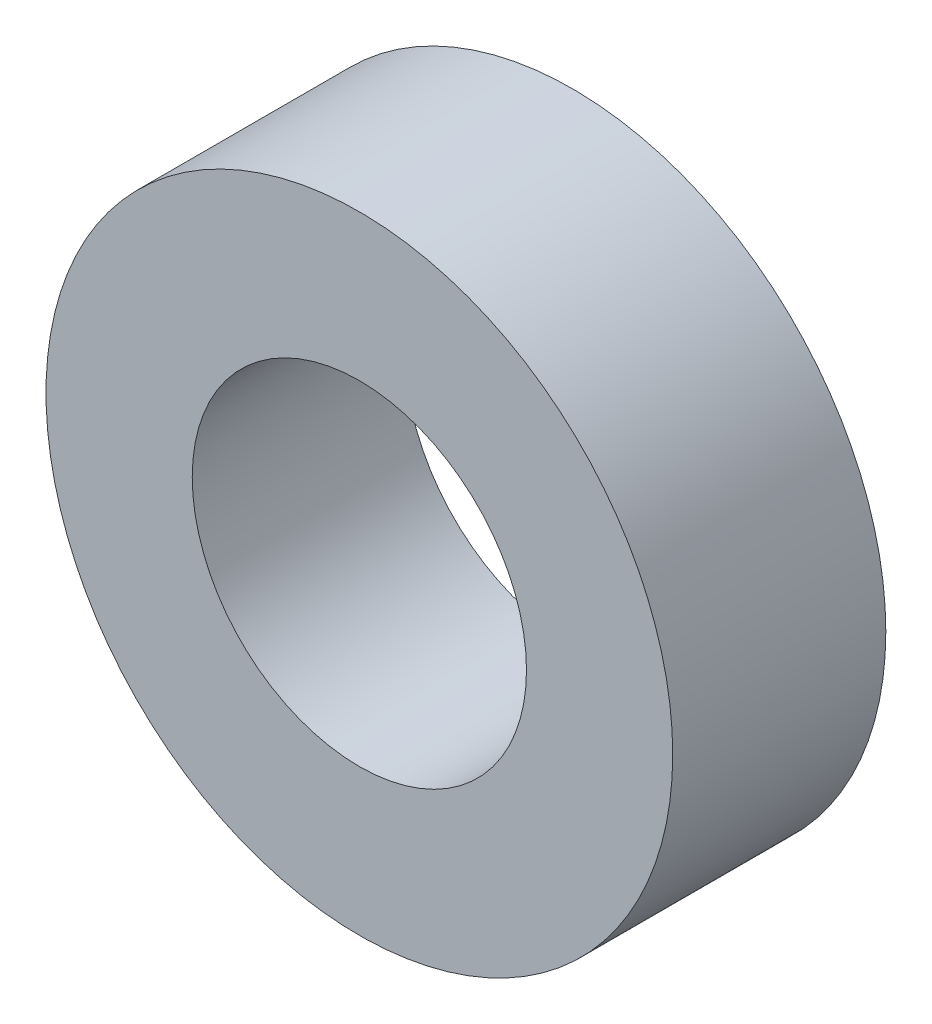
ISO-10303-21;
HEADER;
FILE_DESCRIPTION(('STEP AP214'),'2;1');
FILE_NAME('part.step','',(''),(''),'','','');
FILE_SCHEMA(('AUTOMOTIVE_DESIGN { 1 0 10303 214 1 1 1 1 }'));
ENDSEC;
DATA;
#1=APPLICATION_CONTEXT('core data for automotive mechanical design processes');
#2=APPLICATION_PROTOCOL_DEFINITION('international standard','automotive_design',2000,#1);
#3=PRODUCT_CONTEXT('',#1,'mechanical');
#4=PRODUCT('Part','Part','',(#3));
#5=PRODUCT_RELATED_PRODUCT_CATEGORY('part','',(#4));
#6=PRODUCT_DEFINITION_FORMATION('','',#4);
#7=PRODUCT_DEFINITION_CONTEXT('part definition',#1,'design');
#8=PRODUCT_DEFINITION('design','',#6,#7);
#9=PRODUCT_DEFINITION_SHAPE('','',#8);
#10=(LENGTH_UNIT() NAMED_UNIT(*) SI_UNIT(.MILLI.,.METRE.));
#11=(NAMED_UNIT(*) PLANE_ANGLE_UNIT() SI_UNIT($,.RADIAN.));
#12=(NAMED_UNIT(*) SI_UNIT($,.STERADIAN.) SOLID_ANGLE_UNIT());
#13=UNCERTAINTY_MEASURE_WITH_UNIT(LENGTH_MEASURE(1.E-05),#10,'distance_accuracy_value','');
#14=(GEOMETRIC_REPRESENTATION_CONTEXT(3) GLOBAL_UNCERTAINTY_ASSIGNED_CONTEXT((#13)) GLOBAL_UNIT_ASSIGNED_CONTEXT((#10,
#11,#12)) REPRESENTATION_CONTEXT('',''));
#15=CARTESIAN_POINT('',(0.,0.,0.));
#16=DIRECTION('',(0.,0.,1.));
#17=DIRECTION('',(1.,0.,0.));
#18=AXIS2_PLACEMENT_3D('',#15,#16,#17);
#19=CARTESIAN_POINT('',(0.,0.,5.1));
#20=DIRECTION('',(0.,0.,1.));
#21=DIRECTION('',(1.,0.,0.));
#22=AXIS2_PLACEMENT_3D('',#19,#20,#21);
#23=PLANE('',#22);
#24=CARTESIAN_POINT('',(0.,0.,5.1));
#25=DIRECTION('',(0.,0.,1.));
#26=DIRECTION('',(1.,0.,0.));
#27=AXIS2_PLACEMENT_3D('',#24,#25,#26);
#28=CIRCLE('',#27,7.5);
#29=CARTESIAN_POINT('',(7.5,0.,5.1));
#30=VERTEX_POINT('',#29);
#31=EDGE_CURVE('E10',#30,#30,#28,.T.);
#32=ORIENTED_EDGE('',*,*,#31,.T.);
#33=EDGE_LOOP('',(#32));
#34=FACE_BOUND('',#33,.T.);
#35=CARTESIAN_POINT('',(0.,0.,5.1));
#36=DIRECTION('',(0.,0.,1.));
#37=DIRECTION('',(1.,0.,0.));
#38=AXIS2_PLACEMENT_3D('',#35,#36,#37);
#39=CIRCLE('',#38,4.);
#40=CARTESIAN_POINT('',(4.,0.,5.1));
#41=VERTEX_POINT('',#40);
#42=EDGE_CURVE('E42',#41,#41,#39,.T.);
#43=ORIENTED_EDGE('',*,*,#42,.F.);
#44=EDGE_LOOP('',(#43));
#45=FACE_BOUND('',#44,.T.);
#46=ADVANCED_FACE('F31',(#34,#45),#23,.T.);
#47=CARTESIAN_POINT('',(0.,0.,0.));
#48=DIRECTION('',(0.,0.,1.));
#49=DIRECTION('',(1.,0.,0.));
#50=AXIS2_PLACEMENT_3D('',#47,#48,#49);
#51=PLANE('',#50);
#52=CARTESIAN_POINT('',(0.,0.,0.));
#53=DIRECTION('',(0.,0.,1.));
#54=DIRECTION('',(1.,0.,0.));
#55=AXIS2_PLACEMENT_3D('',#52,#53,#54);
#56=CIRCLE('',#55,7.5);
#57=CARTESIAN_POINT('',(7.5,0.,0.));
#58=VERTEX_POINT('',#57);
#59=EDGE_CURVE('E35',#58,#58,#56,.T.);
#60=ORIENTED_EDGE('',*,*,#59,.F.);
#61=EDGE_LOOP('',(#60));
#62=FACE_BOUND('',#61,.T.);
#63=CARTESIAN_POINT('',(0.,0.,0.));
#64=DIRECTION('',(0.,0.,1.));
#65=DIRECTION('',(1.,0.,0.));
#66=AXIS2_PLACEMENT_3D('',#63,#64,#65);
#67=CIRCLE('',#66,4.);
#68=CARTESIAN_POINT('',(4.,0.,0.));
#69=VERTEX_POINT('',#68);
#70=EDGE_CURVE('E44',#69,#69,#67,.T.);
#71=ORIENTED_EDGE('',*,*,#70,.T.);
#72=EDGE_LOOP('',(#71));
#73=FACE_BOUND('',#72,.T.);
#74=ADVANCED_FACE('F54',(#62,#73),#51,.F.);
#75=CARTESIAN_POINT('',(0.,0.,5.1));
#76=DIRECTION('',(0.,0.,-1.));
#77=DIRECTION('',(-1.,0.,0.));
#78=AXIS2_PLACEMENT_3D('',#75,#76,#77);
#79=CYLINDRICAL_SURFACE('',#78,7.5);
#80=ORIENTED_EDGE('',*,*,#31,.F.);
#81=EDGE_LOOP('',(#80));
#82=FACE_BOUND('',#81,.T.);
#83=ORIENTED_EDGE('',*,*,#59,.T.);
#84=EDGE_LOOP('',(#83));
#85=FACE_BOUND('',#84,.T.);
#86=ADVANCED_FACE('F33',(#82,#85),#79,.T.);
#87=CARTESIAN_POINT('',(0.,0.,5.1));
#88=DIRECTION('',(0.,0.,-1.));
#89=DIRECTION('',(-1.,0.,0.));
#90=AXIS2_PLACEMENT_3D('',#87,#88,#89);
#91=CYLINDRICAL_SURFACE('',#90,4.);
#92=ORIENTED_EDGE('',*,*,#42,.T.);
#93=EDGE_LOOP('',(#92));
#94=FACE_BOUND('',#93,.T.);
#95=ORIENTED_EDGE('',*,*,#70,.F.);
#96=EDGE_LOOP('',(#95));
#97=FACE_BOUND('',#96,.T.);
#98=ADVANCED_FACE('F50',(#94,#97),#91,.F.);
#99=CLOSED_SHELL('',(#46,#74,#86,#98));
#100=MANIFOLD_SOLID_BREP('B2',#99);
#101=ADVANCED_BREP_SHAPE_REPRESENTATION('',(#18,#100),#14);
#102=SHAPE_DEFINITION_REPRESENTATION(#9,#101);
ENDSEC;
END-ISO-10303-21;
